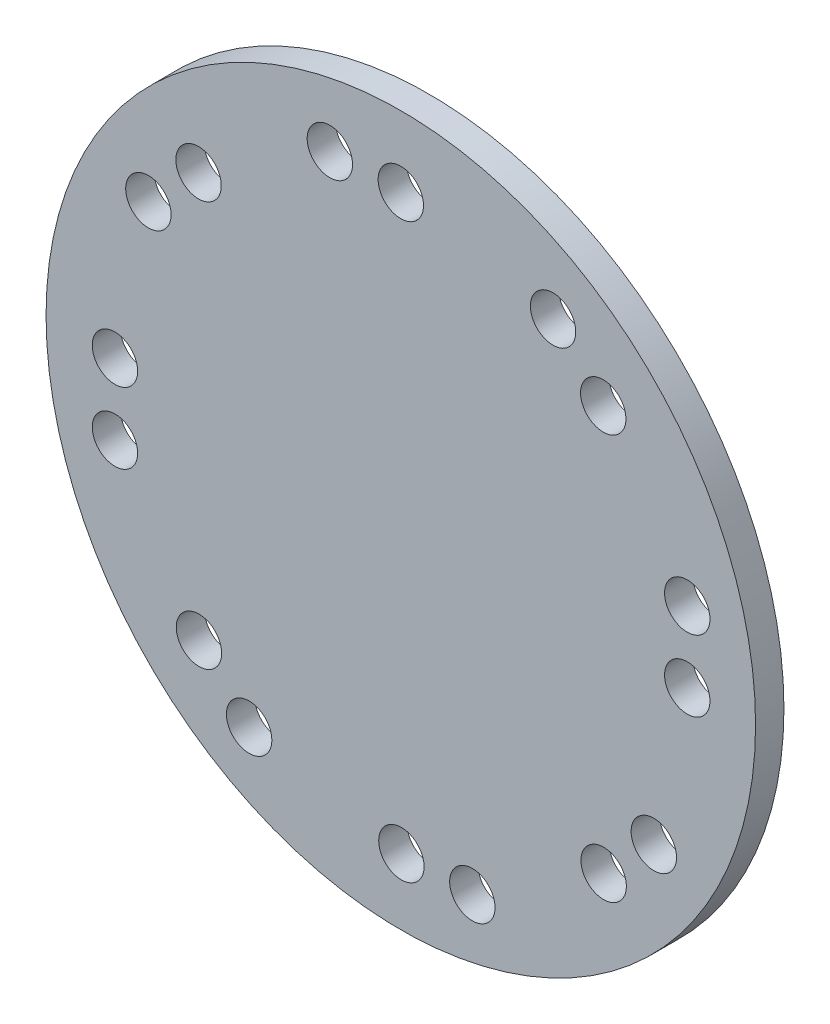
ISO-10303-21;
HEADER;
FILE_DESCRIPTION(('STEP AP214'),'2;1');
FILE_NAME('part.step','',(''),(''),'','','');
FILE_SCHEMA(('AUTOMOTIVE_DESIGN { 1 0 10303 214 1 1 1 1 }'));
ENDSEC;
DATA;
#1=APPLICATION_CONTEXT('core data for automotive mechanical design processes');
#2=APPLICATION_PROTOCOL_DEFINITION('international standard','automotive_design',2000,#1);
#3=PRODUCT_CONTEXT('',#1,'mechanical');
#4=PRODUCT('Part','Part','',(#3));
#5=PRODUCT_RELATED_PRODUCT_CATEGORY('part','',(#4));
#6=PRODUCT_DEFINITION_FORMATION('','',#4);
#7=PRODUCT_DEFINITION_CONTEXT('part definition',#1,'design');
#8=PRODUCT_DEFINITION('design','',#6,#7);
#9=PRODUCT_DEFINITION_SHAPE('','',#8);
#10=(LENGTH_UNIT() NAMED_UNIT(*) SI_UNIT(.MILLI.,.METRE.));
#11=(NAMED_UNIT(*) PLANE_ANGLE_UNIT() SI_UNIT($,.RADIAN.));
#12=(NAMED_UNIT(*) SI_UNIT($,.STERADIAN.) SOLID_ANGLE_UNIT());
#13=UNCERTAINTY_MEASURE_WITH_UNIT(LENGTH_MEASURE(1.E-05),#10,'distance_accuracy_value','');
#14=(GEOMETRIC_REPRESENTATION_CONTEXT(3) GLOBAL_UNCERTAINTY_ASSIGNED_CONTEXT((#13)) GLOBAL_UNIT_ASSIGNED_CONTEXT((#10,
#11,#12)) REPRESENTATION_CONTEXT('',''));
#15=CARTESIAN_POINT('',(0.,0.,0.));
#16=DIRECTION('',(0.,0.,1.));
#17=DIRECTION('',(1.,0.,0.));
#18=AXIS2_PLACEMENT_3D('',#15,#16,#17);
#19=CARTESIAN_POINT('',(0.,0.,2.));
#20=DIRECTION('',(0.,0.,-1.));
#21=DIRECTION('',(-1.,0.,0.));
#22=AXIS2_PLACEMENT_3D('',#19,#20,#21);
#23=CYLINDRICAL_SURFACE('',#22,25.);
#24=CARTESIAN_POINT('',(0.,0.,2.));
#25=DIRECTION('',(0.,0.,1.));
#26=DIRECTION('',(1.,0.,0.));
#27=AXIS2_PLACEMENT_3D('',#24,#25,#26);
#28=CIRCLE('',#27,25.);
#29=CARTESIAN_POINT('',(25.,0.,2.));
#30=VERTEX_POINT('',#29);
#31=EDGE_CURVE('E10',#30,#30,#28,.T.);
#32=ORIENTED_EDGE('',*,*,#31,.F.);
#33=EDGE_LOOP('',(#32));
#34=FACE_BOUND('',#33,.T.);
#35=CARTESIAN_POINT('',(0.,0.,0.));
#36=DIRECTION('',(0.,0.,1.));
#37=DIRECTION('',(1.,0.,0.));
#38=AXIS2_PLACEMENT_3D('',#35,#36,#37);
#39=CIRCLE('',#38,25.);
#40=CARTESIAN_POINT('',(25.,0.,0.));
#41=VERTEX_POINT('',#40);
#42=EDGE_CURVE('E34',#41,#41,#39,.T.);
#43=ORIENTED_EDGE('',*,*,#42,.T.);
#44=EDGE_LOOP('',(#43));
#45=FACE_BOUND('',#44,.T.);
#46=ADVANCED_FACE('F31',(#34,#45),#23,.T.);
#47=CARTESIAN_POINT('',(0.,0.,2.));
#48=DIRECTION('',(0.,0.,1.));
#49=DIRECTION('',(1.,0.,0.));
#50=AXIS2_PLACEMENT_3D('',#47,#48,#49);
#51=PLANE('',#50);
#52=CARTESIAN_POINT('',(-17.7884308079639,10.5436165716317,2.));
#53=DIRECTION('',(0.,0.,1.));
#54=DIRECTION('',(0.707106781186546,0.707106781186549,0.));
#55=AXIS2_PLACEMENT_3D('',#52,#53,#54);
#56=CIRCLE('',#55,1.6);
#57=CARTESIAN_POINT('',(-16.6570599580654,11.6749874215302,2.));
#58=VERTEX_POINT('',#57);
#59=EDGE_CURVE('E104',#58,#58,#56,.T.);
#60=ORIENTED_EDGE('',*,*,#59,.F.);
#61=EDGE_LOOP('',(#60));
#62=FACE_BOUND('',#61,.T.);
#63=CARTESIAN_POINT('',(-20.1445441053107,-0.185842421113834,2.));
#64=DIRECTION('',(0.,0.,1.));
#65=DIRECTION('',(0.,1.,0.));
#66=AXIS2_PLACEMENT_3D('',#63,#64,#65);
#67=CIRCLE('',#66,1.6);
#68=CARTESIAN_POINT('',(-20.1445441053107,1.41415757888617,2.));
#69=VERTEX_POINT('',#68);
#70=EDGE_CURVE('E98',#69,#69,#67,.T.);
#71=ORIENTED_EDGE('',*,*,#70,.F.);
#72=EDGE_LOOP('',(#71));
#73=FACE_BOUND('',#72,.T.);
#74=CARTESIAN_POINT('',(-20.1445441053107,-5.18584242111383,2.));
#75=DIRECTION('',(0.,0.,1.));
#76=DIRECTION('',(0.,1.,0.));
#77=AXIS2_PLACEMENT_3D('',#74,#75,#76);
#78=CIRCLE('',#77,1.6);
#79=CARTESIAN_POINT('',(-20.1445441053107,-3.58584242111383,2.));
#80=VERTEX_POINT('',#79);
#81=EDGE_CURVE('E92',#80,#80,#78,.T.);
#82=ORIENTED_EDGE('',*,*,#81,.F.);
#83=EDGE_LOOP('',(#82));
#84=FACE_BOUND('',#83,.T.);
#85=CARTESIAN_POINT('',(-14.2236945828751,-14.4387393231449,2.));
#86=DIRECTION('',(0.,0.,1.));
#87=DIRECTION('',(-0.707106781186551,0.707106781186544,0.));
#88=AXIS2_PLACEMENT_3D('',#85,#86,#87);
#89=CIRCLE('',#88,1.6);
#90=CARTESIAN_POINT('',(-15.3550654327736,-13.3073684732465,2.));
#91=VERTEX_POINT('',#90);
#92=EDGE_CURVE('E86',#91,#91,#89,.T.);
#93=ORIENTED_EDGE('',*,*,#92,.F.);
#94=EDGE_LOOP('',(#93));
#95=FACE_BOUND('',#94,.T.);
#96=CARTESIAN_POINT('',(-10.6881606769423,-17.9742732290777,2.));
#97=DIRECTION('',(0.,0.,1.));
#98=DIRECTION('',(-0.707106781186551,0.707106781186544,0.));
#99=AXIS2_PLACEMENT_3D('',#96,#97,#98);
#100=CIRCLE('',#99,1.6);
#101=CARTESIAN_POINT('',(-11.8195315268408,-16.8429023791792,2.));
#102=VERTEX_POINT('',#101);
#103=EDGE_CURVE('E80',#102,#102,#100,.T.);
#104=ORIENTED_EDGE('',*,*,#103,.F.);
#105=EDGE_LOOP('',(#104));
#106=FACE_BOUND('',#105,.T.);
#107=CARTESIAN_POINT('',(0.0412983158030577,-20.3303865264245,2.));
#108=DIRECTION('',(0.,0.,1.));
#109=DIRECTION('',(-1.,0.,0.));
#110=AXIS2_PLACEMENT_3D('',#107,#108,#109);
#111=CIRCLE('',#110,1.6);
#112=CARTESIAN_POINT('',(-1.55870168419695,-20.3303865264245,2.));
#113=VERTEX_POINT('',#112);
#114=EDGE_CURVE('E74',#113,#113,#111,.T.);
#115=ORIENTED_EDGE('',*,*,#114,.F.);
#116=EDGE_LOOP('',(#115));
#117=FACE_BOUND('',#116,.T.);
#118=CARTESIAN_POINT('',(5.04129831580306,-20.3303865264245,2.));
#119=DIRECTION('',(0.,0.,1.));
#120=DIRECTION('',(-1.,0.,0.));
#121=AXIS2_PLACEMENT_3D('',#118,#119,#120);
#122=CIRCLE('',#121,1.6);
#123=CARTESIAN_POINT('',(3.44129831580306,-20.3303865264245,2.));
#124=VERTEX_POINT('',#123);
#125=EDGE_CURVE('E68',#124,#124,#122,.T.);
#126=ORIENTED_EDGE('',*,*,#125,.F.);
#127=EDGE_LOOP('',(#126));
#128=FACE_BOUND('',#127,.T.);
#129=CARTESIAN_POINT('',(14.2941952178343,-14.4095370039888,2.));
#130=DIRECTION('',(0.,0.,1.));
#131=DIRECTION('',(-0.707106781186541,-0.707106781186554,0.));
#132=AXIS2_PLACEMENT_3D('',#129,#130,#131);
#133=CIRCLE('',#132,1.6);
#134=CARTESIAN_POINT('',(13.1628243679358,-15.5409078538873,2.));
#135=VERTEX_POINT('',#134);
#136=EDGE_CURVE('E61',#135,#135,#133,.T.);
#137=ORIENTED_EDGE('',*,*,#136,.F.);
#138=EDGE_LOOP('',(#137));
#139=FACE_BOUND('',#138,.T.);
#140=CARTESIAN_POINT('',(17.829729123767,-10.874003098056,2.));
#141=DIRECTION('',(0.,0.,1.));
#142=DIRECTION('',(-0.707106781186541,-0.707106781186554,0.));
#143=AXIS2_PLACEMENT_3D('',#140,#141,#142);
#144=CIRCLE('',#143,1.6);
#145=CARTESIAN_POINT('',(16.6983582738685,-12.0053739479545,2.));
#146=VERTEX_POINT('',#145);
#147=EDGE_CURVE('E133',#146,#146,#144,.T.);
#148=ORIENTED_EDGE('',*,*,#147,.F.);
#149=EDGE_LOOP('',(#148));
#150=FACE_BOUND('',#149,.T.);
#151=CARTESIAN_POINT('',(20.1858424211138,-0.144544105310495,2.));
#152=DIRECTION('',(0.,0.,1.));
#153=DIRECTION('',(0.,-1.,0.));
#154=AXIS2_PLACEMENT_3D('',#151,#152,#153);
#155=CIRCLE('',#154,1.6);
#156=CARTESIAN_POINT('',(20.1858424211138,-1.7445441053105,2.));
#157=VERTEX_POINT('',#156);
#158=EDGE_CURVE('E127',#157,#157,#155,.T.);
#159=ORIENTED_EDGE('',*,*,#158,.F.);
#160=EDGE_LOOP('',(#159));
#161=FACE_BOUND('',#160,.T.);
#162=CARTESIAN_POINT('',(20.1858424211137,4.85545589468951,2.));
#163=DIRECTION('',(0.,0.,1.));
#164=DIRECTION('',(0.,-1.,0.));
#165=AXIS2_PLACEMENT_3D('',#162,#163,#164);
#166=CIRCLE('',#165,1.6);
#167=CARTESIAN_POINT('',(20.1858424211137,3.2554558946895,2.));
#168=VERTEX_POINT('',#167);
#169=EDGE_CURVE('E121',#168,#168,#166,.T.);
#170=ORIENTED_EDGE('',*,*,#169,.F.);
#171=EDGE_LOOP('',(#170));
#172=FACE_BOUND('',#171,.T.);
#173=CARTESIAN_POINT('',(14.264992898678,14.1083527967206,2.));
#174=DIRECTION('',(0.,0.,1.));
#175=DIRECTION('',(0.707106781186556,-0.707106781186539,0.));
#176=AXIS2_PLACEMENT_3D('',#173,#174,#175);
#177=CIRCLE('',#176,1.6);
#178=CARTESIAN_POINT('',(15.3963637485765,12.9769819468221,2.));
#179=VERTEX_POINT('',#178);
#180=EDGE_CURVE('E115',#179,#179,#177,.T.);
#181=ORIENTED_EDGE('',*,*,#180,.F.);
#182=EDGE_LOOP('',(#181));
#183=FACE_BOUND('',#182,.T.);
#184=CARTESIAN_POINT('',(10.7294589927453,17.6438867026533,2.));
#185=DIRECTION('',(0.,0.,1.));
#186=DIRECTION('',(0.707106781186556,-0.707106781186539,0.));
#187=AXIS2_PLACEMENT_3D('',#184,#185,#186);
#188=CIRCLE('',#187,1.6);
#189=CARTESIAN_POINT('',(11.8608298426438,16.5125158527548,2.));
#190=VERTEX_POINT('',#189);
#191=EDGE_CURVE('E109',#190,#190,#188,.T.);
#192=ORIENTED_EDGE('',*,*,#191,.F.);
#193=EDGE_LOOP('',(#192));
#194=FACE_BOUND('',#193,.T.);
#195=CARTESIAN_POINT('',(-14.2528969020311,14.0791504775644,2.));
#196=DIRECTION('',(0.,0.,1.));
#197=DIRECTION('',(0.707106781186546,0.707106781186549,0.));
#198=AXIS2_PLACEMENT_3D('',#195,#196,#197);
#199=CIRCLE('',#198,1.6);
#200=CARTESIAN_POINT('',(-13.1215260521326,15.2105213274629,2.));
#201=VERTEX_POINT('',#200);
#202=EDGE_CURVE('E55',#201,#201,#199,.T.);
#203=ORIENTED_EDGE('',*,*,#202,.F.);
#204=EDGE_LOOP('',(#203));
#205=FACE_BOUND('',#204,.T.);
#206=CARTESIAN_POINT('',(0.,20.,2.));
#207=DIRECTION('',(0.,0.,1.));
#208=DIRECTION('',(1.,0.,0.));
#209=AXIS2_PLACEMENT_3D('',#206,#207,#208);
#210=CIRCLE('',#209,1.6);
#211=CARTESIAN_POINT('',(1.6,20.,2.));
#212=VERTEX_POINT('',#211);
#213=EDGE_CURVE('E50',#212,#212,#210,.T.);
#214=ORIENTED_EDGE('',*,*,#213,.F.);
#215=EDGE_LOOP('',(#214));
#216=FACE_BOUND('',#215,.T.);
#217=CARTESIAN_POINT('',(-5.,20.,2.));
#218=DIRECTION('',(0.,0.,1.));
#219=DIRECTION('',(1.,0.,0.));
#220=AXIS2_PLACEMENT_3D('',#217,#218,#219);
#221=CIRCLE('',#220,1.6);
#222=CARTESIAN_POINT('',(-3.4,20.,2.));
#223=VERTEX_POINT('',#222);
#224=EDGE_CURVE('E43',#223,#223,#221,.T.);
#225=ORIENTED_EDGE('',*,*,#224,.F.);
#226=EDGE_LOOP('',(#225));
#227=FACE_BOUND('',#226,.T.);
#228=ORIENTED_EDGE('',*,*,#31,.T.);
#229=EDGE_LOOP('',(#228));
#230=FACE_BOUND('',#229,.T.);
#231=ADVANCED_FACE('F150',(#62,#73,#84,#95,#106,#117,#128,#139,#150,#161,#172,#183,#194,#205,
#216,#227,#230),#51,.T.);
#232=CARTESIAN_POINT('',(0.,0.,0.));
#233=DIRECTION('',(0.,0.,1.));
#234=DIRECTION('',(1.,0.,0.));
#235=AXIS2_PLACEMENT_3D('',#232,#233,#234);
#236=PLANE('',#235);
#237=CARTESIAN_POINT('',(-17.7884308079639,10.5436165716317,0.));
#238=DIRECTION('',(0.,0.,1.));
#239=DIRECTION('',(0.707106781186546,0.707106781186549,0.));
#240=AXIS2_PLACEMENT_3D('',#237,#238,#239);
#241=CIRCLE('',#240,1.6);
#242=CARTESIAN_POINT('',(-16.6570599580654,11.6749874215302,0.));
#243=VERTEX_POINT('',#242);
#244=EDGE_CURVE('E58',#243,#243,#241,.T.);
#245=ORIENTED_EDGE('',*,*,#244,.T.);
#246=EDGE_LOOP('',(#245));
#247=FACE_BOUND('',#246,.T.);
#248=CARTESIAN_POINT('',(-20.1445441053107,-0.185842421113834,0.));
#249=DIRECTION('',(0.,0.,1.));
#250=DIRECTION('',(0.,1.,0.));
#251=AXIS2_PLACEMENT_3D('',#248,#249,#250);
#252=CIRCLE('',#251,1.6);
#253=CARTESIAN_POINT('',(-20.1445441053107,1.41415757888617,0.));
#254=VERTEX_POINT('',#253);
#255=EDGE_CURVE('E101',#254,#254,#252,.T.);
#256=ORIENTED_EDGE('',*,*,#255,.T.);
#257=EDGE_LOOP('',(#256));
#258=FACE_BOUND('',#257,.T.);
#259=CARTESIAN_POINT('',(-20.1445441053107,-5.18584242111383,0.));
#260=DIRECTION('',(0.,0.,1.));
#261=DIRECTION('',(0.,1.,0.));
#262=AXIS2_PLACEMENT_3D('',#259,#260,#261);
#263=CIRCLE('',#262,1.6);
#264=CARTESIAN_POINT('',(-20.1445441053107,-3.58584242111383,0.));
#265=VERTEX_POINT('',#264);
#266=EDGE_CURVE('E95',#265,#265,#263,.T.);
#267=ORIENTED_EDGE('',*,*,#266,.T.);
#268=EDGE_LOOP('',(#267));
#269=FACE_BOUND('',#268,.T.);
#270=CARTESIAN_POINT('',(-14.2236945828751,-14.4387393231449,0.));
#271=DIRECTION('',(0.,0.,1.));
#272=DIRECTION('',(-0.707106781186551,0.707106781186544,0.));
#273=AXIS2_PLACEMENT_3D('',#270,#271,#272);
#274=CIRCLE('',#273,1.6);
#275=CARTESIAN_POINT('',(-15.3550654327736,-13.3073684732465,0.));
#276=VERTEX_POINT('',#275);
#277=EDGE_CURVE('E89',#276,#276,#274,.T.);
#278=ORIENTED_EDGE('',*,*,#277,.T.);
#279=EDGE_LOOP('',(#278));
#280=FACE_BOUND('',#279,.T.);
#281=CARTESIAN_POINT('',(-10.6881606769423,-17.9742732290777,0.));
#282=DIRECTION('',(0.,0.,1.));
#283=DIRECTION('',(-0.707106781186551,0.707106781186544,0.));
#284=AXIS2_PLACEMENT_3D('',#281,#282,#283);
#285=CIRCLE('',#284,1.6);
#286=CARTESIAN_POINT('',(-11.8195315268408,-16.8429023791792,0.));
#287=VERTEX_POINT('',#286);
#288=EDGE_CURVE('E83',#287,#287,#285,.T.);
#289=ORIENTED_EDGE('',*,*,#288,.T.);
#290=EDGE_LOOP('',(#289));
#291=FACE_BOUND('',#290,.T.);
#292=CARTESIAN_POINT('',(0.0412983158030577,-20.3303865264245,0.));
#293=DIRECTION('',(0.,0.,1.));
#294=DIRECTION('',(-1.,0.,0.));
#295=AXIS2_PLACEMENT_3D('',#292,#293,#294);
#296=CIRCLE('',#295,1.6);
#297=CARTESIAN_POINT('',(-1.55870168419695,-20.3303865264245,0.));
#298=VERTEX_POINT('',#297);
#299=EDGE_CURVE('E77',#298,#298,#296,.T.);
#300=ORIENTED_EDGE('',*,*,#299,.T.);
#301=EDGE_LOOP('',(#300));
#302=FACE_BOUND('',#301,.T.);
#303=CARTESIAN_POINT('',(5.04129831580306,-20.3303865264245,0.));
#304=DIRECTION('',(0.,0.,1.));
#305=DIRECTION('',(-1.,0.,0.));
#306=AXIS2_PLACEMENT_3D('',#303,#304,#305);
#307=CIRCLE('',#306,1.6);
#308=CARTESIAN_POINT('',(3.44129831580306,-20.3303865264245,0.));
#309=VERTEX_POINT('',#308);
#310=EDGE_CURVE('E71',#309,#309,#307,.T.);
#311=ORIENTED_EDGE('',*,*,#310,.T.);
#312=EDGE_LOOP('',(#311));
#313=FACE_BOUND('',#312,.T.);
#314=CARTESIAN_POINT('',(14.2941952178343,-14.4095370039888,0.));
#315=DIRECTION('',(0.,0.,1.));
#316=DIRECTION('',(-0.707106781186541,-0.707106781186554,0.));
#317=AXIS2_PLACEMENT_3D('',#314,#315,#316);
#318=CIRCLE('',#317,1.6);
#319=CARTESIAN_POINT('',(13.1628243679358,-15.5409078538873,0.));
#320=VERTEX_POINT('',#319);
#321=EDGE_CURVE('E64',#320,#320,#318,.T.);
#322=ORIENTED_EDGE('',*,*,#321,.T.);
#323=EDGE_LOOP('',(#322));
#324=FACE_BOUND('',#323,.T.);
#325=CARTESIAN_POINT('',(17.829729123767,-10.874003098056,0.));
#326=DIRECTION('',(0.,0.,1.));
#327=DIRECTION('',(-0.707106781186541,-0.707106781186554,0.));
#328=AXIS2_PLACEMENT_3D('',#325,#326,#327);
#329=CIRCLE('',#328,1.6);
#330=CARTESIAN_POINT('',(16.6983582738685,-12.0053739479545,0.));
#331=VERTEX_POINT('',#330);
#332=EDGE_CURVE('E65',#331,#331,#329,.T.);
#333=ORIENTED_EDGE('',*,*,#332,.T.);
#334=EDGE_LOOP('',(#333));
#335=FACE_BOUND('',#334,.T.);
#336=CARTESIAN_POINT('',(20.1858424211138,-0.144544105310495,0.));
#337=DIRECTION('',(0.,0.,1.));
#338=DIRECTION('',(0.,-1.,0.));
#339=AXIS2_PLACEMENT_3D('',#336,#337,#338);
#340=CIRCLE('',#339,1.6);
#341=CARTESIAN_POINT('',(20.1858424211138,-1.7445441053105,0.));
#342=VERTEX_POINT('',#341);
#343=EDGE_CURVE('E130',#342,#342,#340,.T.);
#344=ORIENTED_EDGE('',*,*,#343,.T.);
#345=EDGE_LOOP('',(#344));
#346=FACE_BOUND('',#345,.T.);
#347=CARTESIAN_POINT('',(20.1858424211137,4.85545589468951,0.));
#348=DIRECTION('',(0.,0.,1.));
#349=DIRECTION('',(0.,-1.,0.));
#350=AXIS2_PLACEMENT_3D('',#347,#348,#349);
#351=CIRCLE('',#350,1.6);
#352=CARTESIAN_POINT('',(20.1858424211137,3.2554558946895,0.));
#353=VERTEX_POINT('',#352);
#354=EDGE_CURVE('E124',#353,#353,#351,.T.);
#355=ORIENTED_EDGE('',*,*,#354,.T.);
#356=EDGE_LOOP('',(#355));
#357=FACE_BOUND('',#356,.T.);
#358=CARTESIAN_POINT('',(14.264992898678,14.1083527967206,0.));
#359=DIRECTION('',(0.,0.,1.));
#360=DIRECTION('',(0.707106781186556,-0.707106781186539,0.));
#361=AXIS2_PLACEMENT_3D('',#358,#359,#360);
#362=CIRCLE('',#361,1.6);
#363=CARTESIAN_POINT('',(15.3963637485765,12.9769819468221,0.));
#364=VERTEX_POINT('',#363);
#365=EDGE_CURVE('E118',#364,#364,#362,.T.);
#366=ORIENTED_EDGE('',*,*,#365,.T.);
#367=EDGE_LOOP('',(#366));
#368=FACE_BOUND('',#367,.T.);
#369=CARTESIAN_POINT('',(10.7294589927453,17.6438867026533,0.));
#370=DIRECTION('',(0.,0.,1.));
#371=DIRECTION('',(0.707106781186556,-0.707106781186539,0.));
#372=AXIS2_PLACEMENT_3D('',#369,#370,#371);
#373=CIRCLE('',#372,1.6);
#374=CARTESIAN_POINT('',(11.8608298426438,16.5125158527548,0.));
#375=VERTEX_POINT('',#374);
#376=EDGE_CURVE('E112',#375,#375,#373,.T.);
#377=ORIENTED_EDGE('',*,*,#376,.T.);
#378=EDGE_LOOP('',(#377));
#379=FACE_BOUND('',#378,.T.);
#380=CARTESIAN_POINT('',(-14.2528969020311,14.0791504775644,0.));
#381=DIRECTION('',(0.,0.,1.));
#382=DIRECTION('',(0.707106781186546,0.707106781186549,0.));
#383=AXIS2_PLACEMENT_3D('',#380,#381,#382);
#384=CIRCLE('',#383,1.6);
#385=CARTESIAN_POINT('',(-13.1215260521326,15.2105213274629,0.));
#386=VERTEX_POINT('',#385);
#387=EDGE_CURVE('E47',#386,#386,#384,.T.);
#388=ORIENTED_EDGE('',*,*,#387,.T.);
#389=EDGE_LOOP('',(#388));
#390=FACE_BOUND('',#389,.T.);
#391=CARTESIAN_POINT('',(0.,20.,0.));
#392=DIRECTION('',(0.,0.,1.));
#393=DIRECTION('',(1.,0.,0.));
#394=AXIS2_PLACEMENT_3D('',#391,#392,#393);
#395=CIRCLE('',#394,1.6);
#396=CARTESIAN_POINT('',(1.6,20.,0.));
#397=VERTEX_POINT('',#396);
#398=EDGE_CURVE('E41',#397,#397,#395,.T.);
#399=ORIENTED_EDGE('',*,*,#398,.T.);
#400=EDGE_LOOP('',(#399));
#401=FACE_BOUND('',#400,.T.);
#402=CARTESIAN_POINT('',(-5.,20.,0.));
#403=DIRECTION('',(0.,0.,1.));
#404=DIRECTION('',(1.,0.,0.));
#405=AXIS2_PLACEMENT_3D('',#402,#403,#404);
#406=CIRCLE('',#405,1.6);
#407=CARTESIAN_POINT('',(-3.4,20.,0.));
#408=VERTEX_POINT('',#407);
#409=EDGE_CURVE('E46',#408,#408,#406,.T.);
#410=ORIENTED_EDGE('',*,*,#409,.T.);
#411=EDGE_LOOP('',(#410));
#412=FACE_BOUND('',#411,.T.);
#413=ORIENTED_EDGE('',*,*,#42,.F.);
#414=EDGE_LOOP('',(#413));
#415=FACE_BOUND('',#414,.T.);
#416=ADVANCED_FACE('F139',(#247,#258,#269,#280,#291,#302,#313,#324,#335,#346,#357,#368,#379,
#390,#401,#412,#415),#236,.F.);
#417=CARTESIAN_POINT('',(-5.,20.,0.));
#418=DIRECTION('',(0.,0.,1.));
#419=DIRECTION('',(1.,0.,0.));
#420=AXIS2_PLACEMENT_3D('',#417,#418,#419);
#421=CYLINDRICAL_SURFACE('',#420,1.6);
#422=ORIENTED_EDGE('',*,*,#409,.F.);
#423=EDGE_LOOP('',(#422));
#424=FACE_BOUND('',#423,.T.);
#425=ORIENTED_EDGE('',*,*,#224,.T.);
#426=EDGE_LOOP('',(#425));
#427=FACE_BOUND('',#426,.T.);
#428=ADVANCED_FACE('F169',(#424,#427),#421,.F.);
#429=CARTESIAN_POINT('',(0.,20.,0.));
#430=DIRECTION('',(0.,0.,1.));
#431=DIRECTION('',(1.,0.,0.));
#432=AXIS2_PLACEMENT_3D('',#429,#430,#431);
#433=CYLINDRICAL_SURFACE('',#432,1.6);
#434=ORIENTED_EDGE('',*,*,#398,.F.);
#435=EDGE_LOOP('',(#434));
#436=FACE_BOUND('',#435,.T.);
#437=ORIENTED_EDGE('',*,*,#213,.T.);
#438=EDGE_LOOP('',(#437));
#439=FACE_BOUND('',#438,.T.);
#440=ADVANCED_FACE('F171',(#436,#439),#433,.F.);
#441=CARTESIAN_POINT('',(-14.2528969020311,14.0791504775644,0.));
#442=DIRECTION('',(0.,0.,1.));
#443=DIRECTION('',(1.,0.,0.));
#444=AXIS2_PLACEMENT_3D('',#441,#442,#443);
#445=CYLINDRICAL_SURFACE('',#444,1.6);
#446=ORIENTED_EDGE('',*,*,#387,.F.);
#447=EDGE_LOOP('',(#446));
#448=FACE_BOUND('',#447,.T.);
#449=ORIENTED_EDGE('',*,*,#202,.T.);
#450=EDGE_LOOP('',(#449));
#451=FACE_BOUND('',#450,.T.);
#452=ADVANCED_FACE('F178',(#448,#451),#445,.F.);
#453=CARTESIAN_POINT('',(10.7294589927453,17.6438867026533,0.));
#454=DIRECTION('',(0.,0.,1.));
#455=DIRECTION('',(1.,0.,0.));
#456=AXIS2_PLACEMENT_3D('',#453,#454,#455);
#457=CYLINDRICAL_SURFACE('',#456,1.6);
#458=ORIENTED_EDGE('',*,*,#376,.F.);
#459=EDGE_LOOP('',(#458));
#460=FACE_BOUND('',#459,.T.);
#461=ORIENTED_EDGE('',*,*,#191,.T.);
#462=EDGE_LOOP('',(#461));
#463=FACE_BOUND('',#462,.T.);
#464=ADVANCED_FACE('F209',(#460,#463),#457,.F.);
#465=CARTESIAN_POINT('',(14.264992898678,14.1083527967206,0.));
#466=DIRECTION('',(0.,0.,1.));
#467=DIRECTION('',(1.,0.,0.));
#468=AXIS2_PLACEMENT_3D('',#465,#466,#467);
#469=CYLINDRICAL_SURFACE('',#468,1.6);
#470=ORIENTED_EDGE('',*,*,#365,.F.);
#471=EDGE_LOOP('',(#470));
#472=FACE_BOUND('',#471,.T.);
#473=ORIENTED_EDGE('',*,*,#180,.T.);
#474=EDGE_LOOP('',(#473));
#475=FACE_BOUND('',#474,.T.);
#476=ADVANCED_FACE('F220',(#472,#475),#469,.F.);
#477=CARTESIAN_POINT('',(20.1858424211137,4.85545589468951,0.));
#478=DIRECTION('',(0.,0.,1.));
#479=DIRECTION('',(1.,0.,0.));
#480=AXIS2_PLACEMENT_3D('',#477,#478,#479);
#481=CYLINDRICAL_SURFACE('',#480,1.6);
#482=ORIENTED_EDGE('',*,*,#354,.F.);
#483=EDGE_LOOP('',(#482));
#484=FACE_BOUND('',#483,.T.);
#485=ORIENTED_EDGE('',*,*,#169,.T.);
#486=EDGE_LOOP('',(#485));
#487=FACE_BOUND('',#486,.T.);
#488=ADVANCED_FACE('F230',(#484,#487),#481,.F.);
#489=CARTESIAN_POINT('',(20.1858424211138,-0.144544105310495,0.));
#490=DIRECTION('',(0.,0.,1.));
#491=DIRECTION('',(1.,0.,0.));
#492=AXIS2_PLACEMENT_3D('',#489,#490,#491);
#493=CYLINDRICAL_SURFACE('',#492,1.6);
#494=ORIENTED_EDGE('',*,*,#343,.F.);
#495=EDGE_LOOP('',(#494));
#496=FACE_BOUND('',#495,.T.);
#497=ORIENTED_EDGE('',*,*,#158,.T.);
#498=EDGE_LOOP('',(#497));
#499=FACE_BOUND('',#498,.T.);
#500=ADVANCED_FACE('F146',(#496,#499),#493,.F.);
#501=CARTESIAN_POINT('',(17.829729123767,-10.874003098056,0.));
#502=DIRECTION('',(0.,0.,1.));
#503=DIRECTION('',(1.,0.,0.));
#504=AXIS2_PLACEMENT_3D('',#501,#502,#503);
#505=CYLINDRICAL_SURFACE('',#504,1.6);
#506=ORIENTED_EDGE('',*,*,#332,.F.);
#507=EDGE_LOOP('',(#506));
#508=FACE_BOUND('',#507,.T.);
#509=ORIENTED_EDGE('',*,*,#147,.T.);
#510=EDGE_LOOP('',(#509));
#511=FACE_BOUND('',#510,.T.);
#512=ADVANCED_FACE('F142',(#508,#511),#505,.F.);
#513=CARTESIAN_POINT('',(14.2941952178343,-14.4095370039888,0.));
#514=DIRECTION('',(0.,0.,1.));
#515=DIRECTION('',(1.,0.,0.));
#516=AXIS2_PLACEMENT_3D('',#513,#514,#515);
#517=CYLINDRICAL_SURFACE('',#516,1.6);
#518=ORIENTED_EDGE('',*,*,#321,.F.);
#519=EDGE_LOOP('',(#518));
#520=FACE_BOUND('',#519,.T.);
#521=ORIENTED_EDGE('',*,*,#136,.T.);
#522=EDGE_LOOP('',(#521));
#523=FACE_BOUND('',#522,.T.);
#524=ADVANCED_FACE('F145',(#520,#523),#517,.F.);
#525=CARTESIAN_POINT('',(5.04129831580306,-20.3303865264245,0.));
#526=DIRECTION('',(0.,0.,1.));
#527=DIRECTION('',(1.,0.,0.));
#528=AXIS2_PLACEMENT_3D('',#525,#526,#527);
#529=CYLINDRICAL_SURFACE('',#528,1.6);
#530=ORIENTED_EDGE('',*,*,#310,.F.);
#531=EDGE_LOOP('',(#530));
#532=FACE_BOUND('',#531,.T.);
#533=ORIENTED_EDGE('',*,*,#125,.T.);
#534=EDGE_LOOP('',(#533));
#535=FACE_BOUND('',#534,.T.);
#536=ADVANCED_FACE('F264',(#532,#535),#529,.F.);
#537=CARTESIAN_POINT('',(0.0412983158030577,-20.3303865264245,0.));
#538=DIRECTION('',(0.,0.,1.));
#539=DIRECTION('',(1.,0.,0.));
#540=AXIS2_PLACEMENT_3D('',#537,#538,#539);
#541=CYLINDRICAL_SURFACE('',#540,1.6);
#542=ORIENTED_EDGE('',*,*,#299,.F.);
#543=EDGE_LOOP('',(#542));
#544=FACE_BOUND('',#543,.T.);
#545=ORIENTED_EDGE('',*,*,#114,.T.);
#546=EDGE_LOOP('',(#545));
#547=FACE_BOUND('',#546,.T.);
#548=ADVANCED_FACE('F274',(#544,#547),#541,.F.);
#549=CARTESIAN_POINT('',(-10.6881606769423,-17.9742732290777,0.));
#550=DIRECTION('',(0.,0.,1.));
#551=DIRECTION('',(1.,0.,0.));
#552=AXIS2_PLACEMENT_3D('',#549,#550,#551);
#553=CYLINDRICAL_SURFACE('',#552,1.6);
#554=ORIENTED_EDGE('',*,*,#288,.F.);
#555=EDGE_LOOP('',(#554));
#556=FACE_BOUND('',#555,.T.);
#557=ORIENTED_EDGE('',*,*,#103,.T.);
#558=EDGE_LOOP('',(#557));
#559=FACE_BOUND('',#558,.T.);
#560=ADVANCED_FACE('F284',(#556,#559),#553,.F.);
#561=CARTESIAN_POINT('',(-14.2236945828751,-14.4387393231449,0.));
#562=DIRECTION('',(0.,0.,1.));
#563=DIRECTION('',(1.,0.,0.));
#564=AXIS2_PLACEMENT_3D('',#561,#562,#563);
#565=CYLINDRICAL_SURFACE('',#564,1.6);
#566=ORIENTED_EDGE('',*,*,#277,.F.);
#567=EDGE_LOOP('',(#566));
#568=FACE_BOUND('',#567,.T.);
#569=ORIENTED_EDGE('',*,*,#92,.T.);
#570=EDGE_LOOP('',(#569));
#571=FACE_BOUND('',#570,.T.);
#572=ADVANCED_FACE('F294',(#568,#571),#565,.F.);
#573=CARTESIAN_POINT('',(-20.1445441053107,-5.18584242111383,0.));
#574=DIRECTION('',(0.,0.,1.));
#575=DIRECTION('',(1.,0.,0.));
#576=AXIS2_PLACEMENT_3D('',#573,#574,#575);
#577=CYLINDRICAL_SURFACE('',#576,1.6);
#578=ORIENTED_EDGE('',*,*,#266,.F.);
#579=EDGE_LOOP('',(#578));
#580=FACE_BOUND('',#579,.T.);
#581=ORIENTED_EDGE('',*,*,#81,.T.);
#582=EDGE_LOOP('',(#581));
#583=FACE_BOUND('',#582,.T.);
#584=ADVANCED_FACE('F304',(#580,#583),#577,.F.);
#585=CARTESIAN_POINT('',(-20.1445441053107,-0.185842421113834,0.));
#586=DIRECTION('',(0.,0.,1.));
#587=DIRECTION('',(1.,0.,0.));
#588=AXIS2_PLACEMENT_3D('',#585,#586,#587);
#589=CYLINDRICAL_SURFACE('',#588,1.6);
#590=ORIENTED_EDGE('',*,*,#255,.F.);
#591=EDGE_LOOP('',(#590));
#592=FACE_BOUND('',#591,.T.);
#593=ORIENTED_EDGE('',*,*,#70,.T.);
#594=EDGE_LOOP('',(#593));
#595=FACE_BOUND('',#594,.T.);
#596=ADVANCED_FACE('F314',(#592,#595),#589,.F.);
#597=CARTESIAN_POINT('',(-17.7884308079639,10.5436165716317,0.));
#598=DIRECTION('',(0.,0.,1.));
#599=DIRECTION('',(1.,0.,0.));
#600=AXIS2_PLACEMENT_3D('',#597,#598,#599);
#601=CYLINDRICAL_SURFACE('',#600,1.6);
#602=ORIENTED_EDGE('',*,*,#244,.F.);
#603=EDGE_LOOP('',(#602));
#604=FACE_BOUND('',#603,.T.);
#605=ORIENTED_EDGE('',*,*,#59,.T.);
#606=EDGE_LOOP('',(#605));
#607=FACE_BOUND('',#606,.T.);
#608=ADVANCED_FACE('F324',(#604,#607),#601,.F.);
#609=CLOSED_SHELL('',(#46,#231,#416,#428,#440,#452,#464,#476,#488,#500,#512,#524,#536,#548,#560,
#572,#584,#596,#608));
#610=MANIFOLD_SOLID_BREP('B2',#609);
#611=ADVANCED_BREP_SHAPE_REPRESENTATION('',(#18,#610),#14);
#612=SHAPE_DEFINITION_REPRESENTATION(#9,#611);
ENDSEC;
END-ISO-10303-21;
